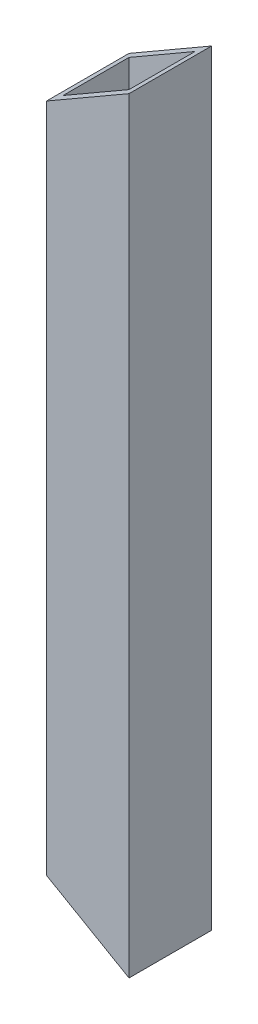
ISO-10303-21;
HEADER;
FILE_DESCRIPTION(('STEP AP214'),'2;1');
FILE_NAME('part.step','',(''),(''),'','','');
FILE_SCHEMA(('AUTOMOTIVE_DESIGN { 1 0 10303 214 1 1 1 1 }'));
ENDSEC;
DATA;
#1=APPLICATION_CONTEXT('core data for automotive mechanical design processes');
#2=APPLICATION_PROTOCOL_DEFINITION('international standard','automotive_design',2000,#1);
#3=PRODUCT_CONTEXT('',#1,'mechanical');
#4=PRODUCT('Part','Part','',(#3));
#5=PRODUCT_RELATED_PRODUCT_CATEGORY('part','',(#4));
#6=PRODUCT_DEFINITION_FORMATION('','',#4);
#7=PRODUCT_DEFINITION_CONTEXT('part definition',#1,'design');
#8=PRODUCT_DEFINITION('design','',#6,#7);
#9=PRODUCT_DEFINITION_SHAPE('','',#8);
#10=(LENGTH_UNIT() NAMED_UNIT(*) SI_UNIT(.MILLI.,.METRE.));
#11=(NAMED_UNIT(*) PLANE_ANGLE_UNIT() SI_UNIT($,.RADIAN.));
#12=(NAMED_UNIT(*) SI_UNIT($,.STERADIAN.) SOLID_ANGLE_UNIT());
#13=UNCERTAINTY_MEASURE_WITH_UNIT(LENGTH_MEASURE(1.E-05),#10,'distance_accuracy_value','');
#14=(GEOMETRIC_REPRESENTATION_CONTEXT(3) GLOBAL_UNCERTAINTY_ASSIGNED_CONTEXT((#13)) GLOBAL_UNIT_ASSIGNED_CONTEXT((#10,
#11,#12)) REPRESENTATION_CONTEXT('',''));
#15=CARTESIAN_POINT('',(0.,0.,0.));
#16=DIRECTION('',(0.,0.,1.));
#17=DIRECTION('',(1.,0.,0.));
#18=AXIS2_PLACEMENT_3D('',#15,#16,#17);
#19=CARTESIAN_POINT('',(223.415724971035,-500000.000000032,1808.3229528099));
#20=DIRECTION('',(-1.,0.,0.));
#21=DIRECTION('',(0.,0.,1.));
#22=AXIS2_PLACEMENT_3D('',#19,#20,#21);
#23=PLANE('',#22);
#24=DIRECTION('',(0.,0.,1.));
#25=VECTOR('',#24,1.);
#26=CARTESIAN_POINT('',(223.41572497125,-128.989128953345,1828.8));
#27=LINE('',#26,#25);
#28=CARTESIAN_POINT('',(223.415724971077,-128.989128953553,1828.8));
#29=VERTEX_POINT('',#28);
#30=CARTESIAN_POINT('',(223.415724971077,-128.989128953568,1797.05));
#31=VERTEX_POINT('',#30);
#32=EDGE_CURVE('E111',#29,#31,#27,.F.);
#33=ORIENTED_EDGE('',*,*,#32,.F.);
#34=DIRECTION('',(0.,1.,0.));
#35=VECTOR('',#34,1.);
#36=CARTESIAN_POINT('',(223.415724970984,-500000.000000032,1828.8));
#37=LINE('',#36,#35);
#38=CARTESIAN_POINT('',(223.415724970961,128.989128952928,1828.8));
#39=VERTEX_POINT('',#38);
#40=EDGE_CURVE('E142',#39,#29,#37,.F.);
#41=ORIENTED_EDGE('',*,*,#40,.F.);
#42=DIRECTION('',(0.,0.,1.));
#43=VECTOR('',#42,1.);
#44=CARTESIAN_POINT('',(223.415724970847,128.989128953112,1828.8));
#45=LINE('',#44,#43);
#46=CARTESIAN_POINT('',(223.415724970975,128.989128952942,1797.05));
#47=VERTEX_POINT('',#46);
#48=EDGE_CURVE('E133',#39,#47,#45,.F.);
#49=ORIENTED_EDGE('',*,*,#48,.T.);
#50=DIRECTION('',(0.,1.,0.));
#51=VECTOR('',#50,1.);
#52=CARTESIAN_POINT('',(223.415724970984,-500000.000000032,1797.05));
#53=LINE('',#52,#51);
#54=EDGE_CURVE('E114',#47,#31,#53,.F.);
#55=ORIENTED_EDGE('',*,*,#54,.T.);
#56=EDGE_LOOP('',(#33,#41,#49,#55));
#57=FACE_BOUND('',#56,.T.);
#58=ADVANCED_FACE('F17',(#57),#23,.T.);
#59=CARTESIAN_POINT('',(237.348847091196,-500000.000000032,1825.625));
#60=DIRECTION('',(0.,0.,1.));
#61=DIRECTION('',(1.,0.,0.));
#62=AXIS2_PLACEMENT_3D('',#59,#60,#61);
#63=PLANE('',#62);
#64=DIRECTION('',(0.,1.,0.));
#65=VECTOR('',#64,1.);
#66=CARTESIAN_POINT('',(251.99072497106,-500000.000000032,1825.625));
#67=LINE('',#66,#65);
#68=CARTESIAN_POINT('',(251.990724971151,-145.486912895642,1825.625));
#69=VERTEX_POINT('',#68);
#70=CARTESIAN_POINT('',(251.990724971059,145.486912895114,1825.625));
#71=VERTEX_POINT('',#70);
#72=EDGE_CURVE('E20',#69,#71,#67,.T.);
#73=ORIENTED_EDGE('',*,*,#72,.F.);
#74=DIRECTION('',(0.866025403784429,-0.500000000000017,0.));
#75=VECTOR('',#74,1.);
#76=CARTESIAN_POINT('',(127.58286248553,-73.66,1825.625));
#77=LINE('',#76,#75);
#78=CARTESIAN_POINT('',(226.59072497108,-130.8222160582,1825.625));
#79=VERTEX_POINT('',#78);
#80=EDGE_CURVE('E105',#79,#69,#77,.T.);
#81=ORIENTED_EDGE('',*,*,#80,.F.);
#82=DIRECTION('',(0.,1.,0.));
#83=VECTOR('',#82,1.);
#84=CARTESIAN_POINT('',(226.590724971035,-500000.000000032,1825.625));
#85=LINE('',#84,#83);
#86=CARTESIAN_POINT('',(226.590724970978,130.822216057681,1825.625));
#87=VERTEX_POINT('',#86);
#88=EDGE_CURVE('E100',#79,#87,#85,.T.);
#89=ORIENTED_EDGE('',*,*,#88,.T.);
#90=DIRECTION('',(0.866025403784429,0.500000000000017,0.));
#91=VECTOR('',#90,1.);
#92=CARTESIAN_POINT('',(127.58286248553,73.66,1825.625));
#93=LINE('',#92,#91);
#94=EDGE_CURVE('E127',#87,#71,#93,.T.);
#95=ORIENTED_EDGE('',*,*,#94,.T.);
#96=EDGE_LOOP('',(#73,#81,#89,#95));
#97=FACE_BOUND('',#96,.T.);
#98=ADVANCED_FACE('F129',(#97),#63,.F.);
#99=CARTESIAN_POINT('',(251.99072497106,-500000.000000032,1808.3229528099));
#100=DIRECTION('',(-1.,0.,0.));
#101=DIRECTION('',(0.,0.,1.));
#102=AXIS2_PLACEMENT_3D('',#99,#100,#101);
#103=PLANE('',#102);
#104=DIRECTION('',(0.,0.,1.));
#105=VECTOR('',#104,1.);
#106=CARTESIAN_POINT('',(251.990724971276,-145.486912895455,1828.8));
#107=LINE('',#106,#105);
#108=CARTESIAN_POINT('',(251.990724971151,-145.486912895642,1800.225));
#109=VERTEX_POINT('',#108);
#110=EDGE_CURVE('E88',#69,#109,#107,.F.);
#111=ORIENTED_EDGE('',*,*,#110,.F.);
#112=ORIENTED_EDGE('',*,*,#72,.T.);
#113=DIRECTION('',(0.,0.,1.));
#114=VECTOR('',#113,1.);
#115=CARTESIAN_POINT('',(251.990724970843,145.486912895204,1828.8));
#116=LINE('',#115,#114);
#117=CARTESIAN_POINT('',(251.990724971026,145.486912895066,1800.225));
#118=VERTEX_POINT('',#117);
#119=EDGE_CURVE('E122',#71,#118,#116,.F.);
#120=ORIENTED_EDGE('',*,*,#119,.T.);
#121=DIRECTION('',(0.,1.,0.));
#122=VECTOR('',#121,1.);
#123=CARTESIAN_POINT('',(251.990724971136,-500000.000000032,1800.225));
#124=LINE('',#123,#122);
#125=EDGE_CURVE('E101',#109,#118,#124,.T.);
#126=ORIENTED_EDGE('',*,*,#125,.F.);
#127=EDGE_LOOP('',(#111,#112,#120,#126));
#128=FACE_BOUND('',#127,.T.);
#129=ADVANCED_FACE('F121',(#128),#103,.T.);
#130=CARTESIAN_POINT('',(241.414785423032,-500000.000000032,1800.225));
#131=DIRECTION('',(0.,0.,1.));
#132=DIRECTION('',(1.,0.,0.));
#133=AXIS2_PLACEMENT_3D('',#130,#131,#132);
#134=PLANE('',#133);
#135=DIRECTION('',(0.866025403784429,-0.500000000000017,0.));
#136=VECTOR('',#135,1.);
#137=CARTESIAN_POINT('',(127.58286248553,-73.66,1800.225));
#138=LINE('',#137,#136);
#139=CARTESIAN_POINT('',(226.590724971068,-130.822216058184,1800.225));
#140=VERTEX_POINT('',#139);
#141=EDGE_CURVE('E80',#109,#140,#138,.F.);
#142=ORIENTED_EDGE('',*,*,#141,.F.);
#143=ORIENTED_EDGE('',*,*,#125,.T.);
#144=DIRECTION('',(0.866025403784429,0.500000000000017,0.));
#145=VECTOR('',#144,1.);
#146=CARTESIAN_POINT('',(127.58286248553,73.66,1800.225));
#147=LINE('',#146,#145);
#148=CARTESIAN_POINT('',(226.590724970967,130.822216057647,1800.225));
#149=VERTEX_POINT('',#148);
#150=EDGE_CURVE('E96',#118,#149,#147,.F.);
#151=ORIENTED_EDGE('',*,*,#150,.T.);
#152=DIRECTION('',(0.,1.,0.));
#153=VECTOR('',#152,1.);
#154=CARTESIAN_POINT('',(226.590724971035,-500000.000000032,1800.225));
#155=LINE('',#154,#153);
#156=EDGE_CURVE('E93',#149,#140,#155,.F.);
#157=ORIENTED_EDGE('',*,*,#156,.T.);
#158=EDGE_LOOP('',(#142,#143,#151,#157));
#159=FACE_BOUND('',#158,.T.);
#160=ADVANCED_FACE('F94',(#159),#134,.T.);
#161=CARTESIAN_POINT('',(226.590724971035,-500000.000000032,1808.3229528099));
#162=DIRECTION('',(-1.,0.,0.));
#163=DIRECTION('',(0.,0.,1.));
#164=AXIS2_PLACEMENT_3D('',#161,#162,#163);
#165=PLANE('',#164);
#166=ORIENTED_EDGE('',*,*,#88,.F.);
#167=DIRECTION('',(0.,0.,1.));
#168=VECTOR('',#167,1.);
#169=CARTESIAN_POINT('',(226.590724971264,-130.822216058031,1828.8));
#170=LINE('',#169,#168);
#171=EDGE_CURVE('E85',#140,#79,#170,.T.);
#172=ORIENTED_EDGE('',*,*,#171,.F.);
#173=ORIENTED_EDGE('',*,*,#156,.F.);
#174=DIRECTION('',(0.,0.,1.));
#175=VECTOR('',#174,1.);
#176=CARTESIAN_POINT('',(226.590724970861,130.822216057798,1828.8));
#177=LINE('',#176,#175);
#178=EDGE_CURVE('E159',#149,#87,#177,.T.);
#179=ORIENTED_EDGE('',*,*,#178,.T.);
#180=EDGE_LOOP('',(#166,#172,#173,#179));
#181=FACE_BOUND('',#180,.T.);
#182=ADVANCED_FACE('F103',(#181),#165,.F.);
#183=CARTESIAN_POINT('',(241.414785423032,-500000.000000032,1797.05));
#184=DIRECTION('',(0.,0.,1.));
#185=DIRECTION('',(1.,0.,0.));
#186=AXIS2_PLACEMENT_3D('',#183,#184,#185);
#187=PLANE('',#186);
#188=DIRECTION('',(0.,1.,0.));
#189=VECTOR('',#188,1.);
#190=CARTESIAN_POINT('',(255.16572497106,-500000.000000032,1797.05));
#191=LINE('',#190,#189);
#192=CARTESIAN_POINT('',(255.165724971027,147.319999999725,1797.05));
#193=VERTEX_POINT('',#192);
#194=CARTESIAN_POINT('',(255.1657249711,-147.320000000308,1797.05));
#195=VERTEX_POINT('',#194);
#196=EDGE_CURVE('E156',#193,#195,#191,.F.);
#197=ORIENTED_EDGE('',*,*,#196,.T.);
#198=DIRECTION('',(0.866025403784429,-0.500000000000017,0.));
#199=VECTOR('',#198,1.);
#200=CARTESIAN_POINT('',(127.58286248553,-73.66,1797.05));
#201=LINE('',#200,#199);
#202=EDGE_CURVE('E90',#31,#195,#201,.T.);
#203=ORIENTED_EDGE('',*,*,#202,.F.);
#204=ORIENTED_EDGE('',*,*,#54,.F.);
#205=DIRECTION('',(0.866025403784429,0.500000000000017,0.));
#206=VECTOR('',#205,1.);
#207=CARTESIAN_POINT('',(127.58286248553,73.66,1797.05));
#208=LINE('',#207,#206);
#209=EDGE_CURVE('E130',#47,#193,#208,.T.);
#210=ORIENTED_EDGE('',*,*,#209,.T.);
#211=EDGE_LOOP('',(#197,#203,#204,#210));
#212=FACE_BOUND('',#211,.T.);
#213=ADVANCED_FACE('F163',(#212),#187,.F.);
#214=CARTESIAN_POINT('',(127.58286248553,-73.66,1828.8));
#215=DIRECTION('',(-0.500000000000017,-0.866025403784429,0.));
#216=DIRECTION('',(0.866025403784429,-0.500000000000017,0.));
#217=AXIS2_PLACEMENT_3D('',#214,#215,#216);
#218=PLANE('',#217);
#219=ORIENTED_EDGE('',*,*,#80,.T.);
#220=ORIENTED_EDGE('',*,*,#110,.T.);
#221=ORIENTED_EDGE('',*,*,#141,.T.);
#222=ORIENTED_EDGE('',*,*,#171,.T.);
#223=EDGE_LOOP('',(#219,#220,#221,#222));
#224=FACE_BOUND('',#223,.T.);
#225=DIRECTION('',(0.,0.,1.));
#226=VECTOR('',#225,1.);
#227=CARTESIAN_POINT('',(255.16572497106,-147.320000000377,1808.3229528099));
#228=LINE('',#227,#226);
#229=CARTESIAN_POINT('',(255.165724971136,-147.320000000222,1828.8));
#230=VERTEX_POINT('',#229);
#231=EDGE_CURVE('E153',#195,#230,#228,.T.);
#232=ORIENTED_EDGE('',*,*,#231,.T.);
#233=DIRECTION('',(0.866025403784755,-0.499999999999452,0.));
#234=VECTOR('',#233,1.);
#235=CARTESIAN_POINT('',(223.415724971111,-128.989128953606,1828.8));
#236=LINE('',#235,#234);
#237=EDGE_CURVE('E140',#29,#230,#236,.T.);
#238=ORIENTED_EDGE('',*,*,#237,.F.);
#239=ORIENTED_EDGE('',*,*,#32,.T.);
#240=ORIENTED_EDGE('',*,*,#202,.T.);
#241=EDGE_LOOP('',(#232,#238,#239,#240));
#242=FACE_BOUND('',#241,.T.);
#243=ADVANCED_FACE('F82',(#224,#242),#218,.T.);
#244=CARTESIAN_POINT('',(237.348847091196,-500000.000000032,1828.8));
#245=DIRECTION('',(0.,0.,1.));
#246=DIRECTION('',(1.,0.,0.));
#247=AXIS2_PLACEMENT_3D('',#244,#245,#246);
#248=PLANE('',#247);
#249=ORIENTED_EDGE('',*,*,#237,.T.);
#250=DIRECTION('',(0.,1.,0.));
#251=VECTOR('',#250,1.);
#252=CARTESIAN_POINT('',(255.16572497106,-500000.000000032,1828.8));
#253=LINE('',#252,#251);
#254=CARTESIAN_POINT('',(255.165724971021,147.319999999708,1828.8));
#255=VERTEX_POINT('',#254);
#256=EDGE_CURVE('E26',#230,#255,#253,.T.);
#257=ORIENTED_EDGE('',*,*,#256,.T.);
#258=DIRECTION('',(0.866025403784429,0.500000000000017,0.));
#259=VECTOR('',#258,1.);
#260=CARTESIAN_POINT('',(127.58286248553,73.66,1828.8));
#261=LINE('',#260,#259);
#262=EDGE_CURVE('E34',#255,#39,#261,.F.);
#263=ORIENTED_EDGE('',*,*,#262,.T.);
#264=ORIENTED_EDGE('',*,*,#40,.T.);
#265=EDGE_LOOP('',(#249,#257,#263,#264));
#266=FACE_BOUND('',#265,.T.);
#267=ADVANCED_FACE('F145',(#266),#248,.T.);
#268=CARTESIAN_POINT('',(127.58286248553,73.66,1828.8));
#269=DIRECTION('',(0.500000000000017,-0.866025403784429,0.));
#270=DIRECTION('',(0.866025403784429,0.500000000000017,0.));
#271=AXIS2_PLACEMENT_3D('',#268,#269,#270);
#272=PLANE('',#271);
#273=ORIENTED_EDGE('',*,*,#150,.F.);
#274=ORIENTED_EDGE('',*,*,#119,.F.);
#275=ORIENTED_EDGE('',*,*,#94,.F.);
#276=ORIENTED_EDGE('',*,*,#178,.F.);
#277=EDGE_LOOP('',(#273,#274,#275,#276));
#278=FACE_BOUND('',#277,.T.);
#279=ORIENTED_EDGE('',*,*,#48,.F.);
#280=ORIENTED_EDGE('',*,*,#262,.F.);
#281=DIRECTION('',(0.,0.,1.));
#282=VECTOR('',#281,1.);
#283=CARTESIAN_POINT('',(255.16572497106,147.319999999638,1808.3229528099));
#284=LINE('',#283,#282);
#285=EDGE_CURVE('E11',#255,#193,#284,.F.);
#286=ORIENTED_EDGE('',*,*,#285,.T.);
#287=ORIENTED_EDGE('',*,*,#209,.F.);
#288=EDGE_LOOP('',(#279,#280,#286,#287));
#289=FACE_BOUND('',#288,.T.);
#290=ADVANCED_FACE('F126',(#278,#289),#272,.F.);
#291=CARTESIAN_POINT('',(255.16572497106,-500000.000000032,1808.3229528099));
#292=DIRECTION('',(-1.,0.,0.));
#293=DIRECTION('',(0.,0.,1.));
#294=AXIS2_PLACEMENT_3D('',#291,#292,#293);
#295=PLANE('',#294);
#296=ORIENTED_EDGE('',*,*,#256,.F.);
#297=ORIENTED_EDGE('',*,*,#231,.F.);
#298=ORIENTED_EDGE('',*,*,#196,.F.);
#299=ORIENTED_EDGE('',*,*,#285,.F.);
#300=EDGE_LOOP('',(#296,#297,#298,#299));
#301=FACE_BOUND('',#300,.T.);
#302=ADVANCED_FACE('F165',(#301),#295,.F.);
#303=CLOSED_SHELL('',(#58,#98,#129,#160,#182,#213,#243,#267,#290,#302));
#304=MANIFOLD_SOLID_BREP('B1',#303);
#305=ADVANCED_BREP_SHAPE_REPRESENTATION('',(#18,#304),#14);
#306=SHAPE_DEFINITION_REPRESENTATION(#9,#305);
ENDSEC;
END-ISO-10303-21;
